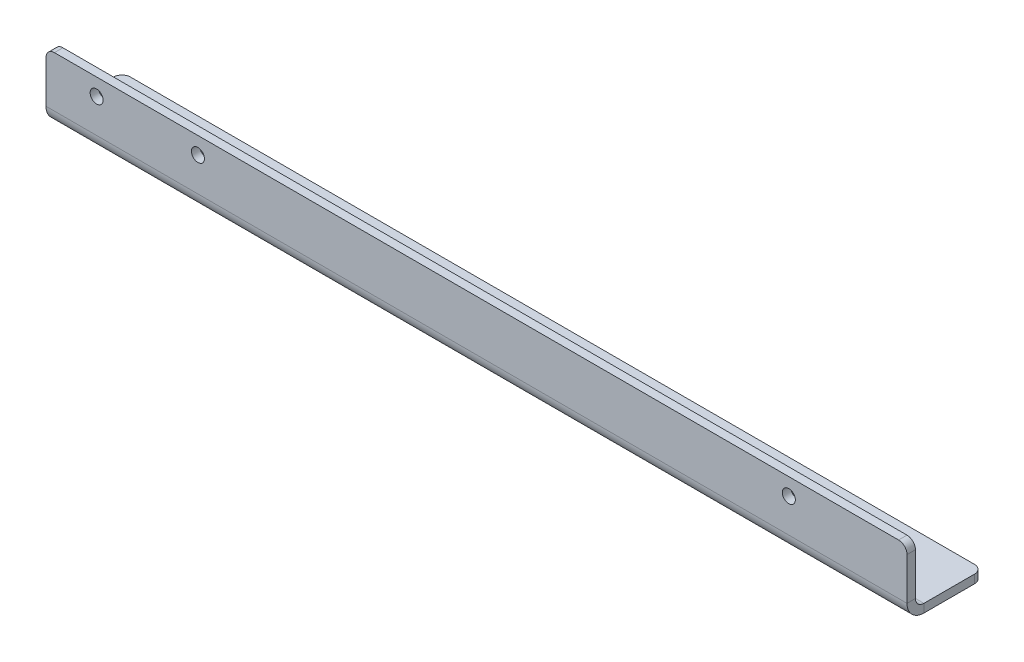
ISO-10303-21;
HEADER;
FILE_DESCRIPTION(('STEP AP214'),'2;1');
FILE_NAME('part.step','',(''),(''),'','','');
FILE_SCHEMA(('AUTOMOTIVE_DESIGN { 1 0 10303 214 1 1 1 1 }'));
ENDSEC;
DATA;
#1=APPLICATION_CONTEXT('core data for automotive mechanical design processes');
#2=APPLICATION_PROTOCOL_DEFINITION('international standard','automotive_design',2000,#1);
#3=PRODUCT_CONTEXT('',#1,'mechanical');
#4=PRODUCT('Part','Part','',(#3));
#5=PRODUCT_RELATED_PRODUCT_CATEGORY('part','',(#4));
#6=PRODUCT_DEFINITION_FORMATION('','',#4);
#7=PRODUCT_DEFINITION_CONTEXT('part definition',#1,'design');
#8=PRODUCT_DEFINITION('design','',#6,#7);
#9=PRODUCT_DEFINITION_SHAPE('','',#8);
#10=(LENGTH_UNIT() NAMED_UNIT(*) SI_UNIT(.MILLI.,.METRE.));
#11=(NAMED_UNIT(*) PLANE_ANGLE_UNIT() SI_UNIT($,.RADIAN.));
#12=(NAMED_UNIT(*) SI_UNIT($,.STERADIAN.) SOLID_ANGLE_UNIT());
#13=UNCERTAINTY_MEASURE_WITH_UNIT(LENGTH_MEASURE(1.E-05),#10,'distance_accuracy_value','');
#14=(GEOMETRIC_REPRESENTATION_CONTEXT(3) GLOBAL_UNCERTAINTY_ASSIGNED_CONTEXT((#13)) GLOBAL_UNIT_ASSIGNED_CONTEXT((#10,
#11,#12)) REPRESENTATION_CONTEXT('',''));
#15=CARTESIAN_POINT('',(0.,0.,0.));
#16=DIRECTION('',(0.,0.,1.));
#17=DIRECTION('',(1.,0.,0.));
#18=AXIS2_PLACEMENT_3D('',#15,#16,#17);
#19=CARTESIAN_POINT('',(323.85,-3.175,0.));
#20=DIRECTION('',(1.,0.,0.));
#21=DIRECTION('',(0.,0.,-1.));
#22=AXIS2_PLACEMENT_3D('',#19,#20,#21);
#23=PLANE('',#22);
#24=DIRECTION('',(0.,0.,-1.));
#25=VECTOR('',#24,1.);
#26=CARTESIAN_POINT('',(323.85,-3.175,0.));
#27=LINE('',#26,#25);
#28=CARTESIAN_POINT('',(323.85,-3.17500000000001,-6.34999999999999));
#29=VERTEX_POINT('',#28);
#30=CARTESIAN_POINT('',(323.85,-3.175,-25.4));
#31=VERTEX_POINT('',#30);
#32=EDGE_CURVE('E421',#29,#31,#27,.T.);
#33=ORIENTED_EDGE('',*,*,#32,.T.);
#34=DIRECTION('',(0.,1.,0.));
#35=VECTOR('',#34,1.);
#36=CARTESIAN_POINT('',(323.85,-3.175,-25.4));
#37=LINE('',#36,#35);
#38=CARTESIAN_POINT('',(323.85,0.,-25.4));
#39=VERTEX_POINT('',#38);
#40=EDGE_CURVE('E430',#31,#39,#37,.T.);
#41=ORIENTED_EDGE('',*,*,#40,.T.);
#42=DIRECTION('',(0.,0.,-1.));
#43=VECTOR('',#42,1.);
#44=CARTESIAN_POINT('',(323.85,0.,0.));
#45=LINE('',#44,#43);
#46=CARTESIAN_POINT('',(323.85,0.,-6.34999999999999));
#47=VERTEX_POINT('',#46);
#48=EDGE_CURVE('E433',#47,#39,#45,.T.);
#49=ORIENTED_EDGE('',*,*,#48,.F.);
#50=DIRECTION('',(0.,-1.,0.));
#51=VECTOR('',#50,1.);
#52=CARTESIAN_POINT('',(323.85,0.,-6.34999999999999));
#53=LINE('',#52,#51);
#54=EDGE_CURVE('E399',#47,#29,#53,.T.);
#55=ORIENTED_EDGE('',*,*,#54,.T.);
#56=EDGE_LOOP('',(#33,#41,#49,#55));
#57=FACE_BOUND('',#56,.T.);
#58=ADVANCED_FACE('F246',(#57),#23,.T.);
#59=CARTESIAN_POINT('',(0.,-3.175,0.));
#60=DIRECTION('',(0.,1.,0.));
#61=DIRECTION('',(0.,0.,1.));
#62=AXIS2_PLACEMENT_3D('',#59,#60,#61);
#63=PLANE('',#62);
#64=CARTESIAN_POINT('',(19.05,-3.175,-19.05));
#65=DIRECTION('',(0.,1.,0.));
#66=DIRECTION('',(0.,0.,1.));
#67=AXIS2_PLACEMENT_3D('',#64,#65,#66);
#68=CIRCLE('',#67,2.4511);
#69=CARTESIAN_POINT('',(19.05,-3.175,-16.5989));
#70=VERTEX_POINT('',#69);
#71=EDGE_CURVE('E394',#70,#70,#68,.T.);
#72=ORIENTED_EDGE('',*,*,#71,.T.);
#73=EDGE_LOOP('',(#72));
#74=FACE_BOUND('',#73,.T.);
#75=CARTESIAN_POINT('',(57.15,-3.175,-19.05));
#76=DIRECTION('',(0.,1.,0.));
#77=DIRECTION('',(0.,0.,1.));
#78=AXIS2_PLACEMENT_3D('',#75,#76,#77);
#79=CIRCLE('',#78,2.4511);
#80=CARTESIAN_POINT('',(57.15,-3.175,-16.5989));
#81=VERTEX_POINT('',#80);
#82=EDGE_CURVE('E637',#81,#81,#79,.T.);
#83=ORIENTED_EDGE('',*,*,#82,.T.);
#84=EDGE_LOOP('',(#83));
#85=FACE_BOUND('',#84,.T.);
#86=CARTESIAN_POINT('',(279.4,-3.175,-19.05));
#87=DIRECTION('',(0.,1.,0.));
#88=DIRECTION('',(0.,0.,1.));
#89=AXIS2_PLACEMENT_3D('',#86,#87,#88);
#90=CIRCLE('',#89,2.45109999999997);
#91=CARTESIAN_POINT('',(279.4,-3.175,-16.5989000000001));
#92=VERTEX_POINT('',#91);
#93=EDGE_CURVE('E645',#92,#92,#90,.T.);
#94=ORIENTED_EDGE('',*,*,#93,.T.);
#95=EDGE_LOOP('',(#94));
#96=FACE_BOUND('',#95,.T.);
#97=DIRECTION('',(-1.,0.,0.));
#98=VECTOR('',#97,1.);
#99=CARTESIAN_POINT('',(323.85,-3.175,-28.575));
#100=LINE('',#99,#98);
#101=CARTESIAN_POINT('',(320.675,-3.175,-28.575));
#102=VERTEX_POINT('',#101);
#103=CARTESIAN_POINT('',(3.17499999999998,-3.175,-28.575));
#104=VERTEX_POINT('',#103);
#105=EDGE_CURVE('E426',#102,#104,#100,.T.);
#106=ORIENTED_EDGE('',*,*,#105,.F.);
#107=CARTESIAN_POINT('',(320.675,-3.175,-25.4));
#108=DIRECTION('',(0.,1.,0.));
#109=DIRECTION('',(0.,0.,1.));
#110=AXIS2_PLACEMENT_3D('',#107,#108,#109);
#111=CIRCLE('',#110,3.175);
#112=EDGE_CURVE('E459',#102,#31,#111,.F.);
#113=ORIENTED_EDGE('',*,*,#112,.T.);
#114=ORIENTED_EDGE('',*,*,#32,.F.);
#115=DIRECTION('',(1.,0.,0.));
#116=VECTOR('',#115,1.);
#117=CARTESIAN_POINT('',(323.85,-3.17500000000001,-6.34999999999999));
#118=LINE('',#117,#116);
#119=CARTESIAN_POINT('',(1.66533453693773E-13,-3.175,-6.34999999999999));
#120=VERTEX_POINT('',#119);
#121=EDGE_CURVE('E347',#29,#120,#118,.F.);
#122=ORIENTED_EDGE('',*,*,#121,.T.);
#123=DIRECTION('',(0.,0.,1.));
#124=VECTOR('',#123,1.);
#125=CARTESIAN_POINT('',(0.,-3.175,-28.575));
#126=LINE('',#125,#124);
#127=CARTESIAN_POINT('',(0.,-3.175,-25.4));
#128=VERTEX_POINT('',#127);
#129=EDGE_CURVE('E418',#128,#120,#126,.T.);
#130=ORIENTED_EDGE('',*,*,#129,.F.);
#131=CARTESIAN_POINT('',(3.17499999999998,-3.175,-25.4));
#132=DIRECTION('',(0.,1.,0.));
#133=DIRECTION('',(0.,0.,1.));
#134=AXIS2_PLACEMENT_3D('',#131,#132,#133);
#135=CIRCLE('',#134,3.175);
#136=EDGE_CURVE('E456',#128,#104,#135,.F.);
#137=ORIENTED_EDGE('',*,*,#136,.T.);
#138=EDGE_LOOP('',(#106,#113,#114,#122,#130,#137));
#139=FACE_BOUND('',#138,.T.);
#140=ADVANCED_FACE('F508',(#74,#85,#96,#139),#63,.F.);
#141=CARTESIAN_POINT('',(0.,0.,0.));
#142=DIRECTION('',(0.,1.,0.));
#143=DIRECTION('',(0.,0.,1.));
#144=AXIS2_PLACEMENT_3D('',#141,#142,#143);
#145=PLANE('',#144);
#146=CARTESIAN_POINT('',(19.05,0.,-19.05));
#147=DIRECTION('',(0.,1.,0.));
#148=DIRECTION('',(0.,0.,1.));
#149=AXIS2_PLACEMENT_3D('',#146,#147,#148);
#150=CIRCLE('',#149,2.4511);
#151=CARTESIAN_POINT('',(19.05,0.,-16.5989));
#152=VERTEX_POINT('',#151);
#153=EDGE_CURVE('E633',#152,#152,#150,.T.);
#154=ORIENTED_EDGE('',*,*,#153,.F.);
#155=EDGE_LOOP('',(#154));
#156=FACE_BOUND('',#155,.T.);
#157=CARTESIAN_POINT('',(57.15,0.,-19.05));
#158=DIRECTION('',(0.,1.,0.));
#159=DIRECTION('',(0.,0.,1.));
#160=AXIS2_PLACEMENT_3D('',#157,#158,#159);
#161=CIRCLE('',#160,2.4511);
#162=CARTESIAN_POINT('',(57.15,0.,-16.5989));
#163=VERTEX_POINT('',#162);
#164=EDGE_CURVE('E641',#163,#163,#161,.T.);
#165=ORIENTED_EDGE('',*,*,#164,.F.);
#166=EDGE_LOOP('',(#165));
#167=FACE_BOUND('',#166,.T.);
#168=CARTESIAN_POINT('',(279.4,0.,-19.05));
#169=DIRECTION('',(0.,1.,0.));
#170=DIRECTION('',(0.,0.,1.));
#171=AXIS2_PLACEMENT_3D('',#168,#169,#170);
#172=CIRCLE('',#171,2.45109999999997);
#173=CARTESIAN_POINT('',(279.4,0.,-16.5989000000001));
#174=VERTEX_POINT('',#173);
#175=EDGE_CURVE('E613',#174,#174,#172,.T.);
#176=ORIENTED_EDGE('',*,*,#175,.F.);
#177=EDGE_LOOP('',(#176));
#178=FACE_BOUND('',#177,.T.);
#179=ORIENTED_EDGE('',*,*,#48,.T.);
#180=CARTESIAN_POINT('',(320.675,0.,-25.4));
#181=DIRECTION('',(0.,1.,0.));
#182=DIRECTION('',(0.,0.,1.));
#183=AXIS2_PLACEMENT_3D('',#180,#181,#182);
#184=CIRCLE('',#183,3.175);
#185=CARTESIAN_POINT('',(320.675,0.,-28.575));
#186=VERTEX_POINT('',#185);
#187=EDGE_CURVE('E446',#39,#186,#184,.T.);
#188=ORIENTED_EDGE('',*,*,#187,.T.);
#189=DIRECTION('',(-1.,0.,0.));
#190=VECTOR('',#189,1.);
#191=CARTESIAN_POINT('',(323.85,0.,-28.575));
#192=LINE('',#191,#190);
#193=CARTESIAN_POINT('',(3.17499999999998,0.,-28.575));
#194=VERTEX_POINT('',#193);
#195=EDGE_CURVE('E422',#186,#194,#192,.T.);
#196=ORIENTED_EDGE('',*,*,#195,.T.);
#197=CARTESIAN_POINT('',(3.17499999999998,0.,-25.4));
#198=DIRECTION('',(0.,1.,0.));
#199=DIRECTION('',(0.,0.,1.));
#200=AXIS2_PLACEMENT_3D('',#197,#198,#199);
#201=CIRCLE('',#200,3.175);
#202=CARTESIAN_POINT('',(0.,0.,-25.4));
#203=VERTEX_POINT('',#202);
#204=EDGE_CURVE('E443',#194,#203,#201,.T.);
#205=ORIENTED_EDGE('',*,*,#204,.T.);
#206=DIRECTION('',(0.,0.,1.));
#207=VECTOR('',#206,1.);
#208=CARTESIAN_POINT('',(0.,0.,-28.575));
#209=LINE('',#208,#207);
#210=CARTESIAN_POINT('',(1.66533453693773E-13,0.,-6.34999999999999));
#211=VERTEX_POINT('',#210);
#212=EDGE_CURVE('E414',#203,#211,#209,.T.);
#213=ORIENTED_EDGE('',*,*,#212,.T.);
#214=DIRECTION('',(1.,0.,0.));
#215=VECTOR('',#214,1.);
#216=CARTESIAN_POINT('',(323.85,0.,-6.34999999999999));
#217=LINE('',#216,#215);
#218=EDGE_CURVE('E404',#47,#211,#217,.F.);
#219=ORIENTED_EDGE('',*,*,#218,.F.);
#220=EDGE_LOOP('',(#179,#188,#196,#205,#213,#219));
#221=FACE_BOUND('',#220,.T.);
#222=ADVANCED_FACE('F514',(#156,#167,#178,#221),#145,.T.);
#223=CARTESIAN_POINT('',(0.,-3.175,-28.575));
#224=DIRECTION('',(-1.,0.,0.));
#225=DIRECTION('',(0.,0.,1.));
#226=AXIS2_PLACEMENT_3D('',#223,#224,#225);
#227=PLANE('',#226);
#228=ORIENTED_EDGE('',*,*,#212,.F.);
#229=DIRECTION('',(0.,1.,0.));
#230=VECTOR('',#229,1.);
#231=CARTESIAN_POINT('',(0.,-3.175,-25.4));
#232=LINE('',#231,#230);
#233=EDGE_CURVE('E13',#203,#128,#232,.F.);
#234=ORIENTED_EDGE('',*,*,#233,.T.);
#235=ORIENTED_EDGE('',*,*,#129,.T.);
#236=DIRECTION('',(0.,-1.,0.));
#237=VECTOR('',#236,1.);
#238=CARTESIAN_POINT('',(1.66533453693773E-13,0.,-6.34999999999999));
#239=LINE('',#238,#237);
#240=EDGE_CURVE('E410',#211,#120,#239,.T.);
#241=ORIENTED_EDGE('',*,*,#240,.F.);
#242=EDGE_LOOP('',(#228,#234,#235,#241));
#243=FACE_BOUND('',#242,.T.);
#244=ADVANCED_FACE('F502',(#243),#227,.T.);
#245=CARTESIAN_POINT('',(323.85,-3.175,-28.575));
#246=DIRECTION('',(0.,0.,-1.));
#247=DIRECTION('',(-1.,0.,0.));
#248=AXIS2_PLACEMENT_3D('',#245,#246,#247);
#249=PLANE('',#248);
#250=ORIENTED_EDGE('',*,*,#195,.F.);
#251=DIRECTION('',(0.,1.,0.));
#252=VECTOR('',#251,1.);
#253=CARTESIAN_POINT('',(320.675,-3.175,-28.575));
#254=LINE('',#253,#252);
#255=EDGE_CURVE('E453',#186,#102,#254,.F.);
#256=ORIENTED_EDGE('',*,*,#255,.T.);
#257=ORIENTED_EDGE('',*,*,#105,.T.);
#258=DIRECTION('',(0.,1.,0.));
#259=VECTOR('',#258,1.);
#260=CARTESIAN_POINT('',(3.17499999999998,-3.175,-28.575));
#261=LINE('',#260,#259);
#262=EDGE_CURVE('E449',#104,#194,#261,.T.);
#263=ORIENTED_EDGE('',*,*,#262,.T.);
#264=EDGE_LOOP('',(#250,#256,#257,#263));
#265=FACE_BOUND('',#264,.T.);
#266=ADVANCED_FACE('F519',(#265),#249,.T.);
#267=CARTESIAN_POINT('',(1.11022302462516E-13,3.17499999999999,-6.34999999999999));
#268=DIRECTION('',(-1.,0.,0.));
#269=DIRECTION('',(0.,0.,1.));
#270=AXIS2_PLACEMENT_3D('',#267,#268,#269);
#271=PLANE('',#270);
#272=DIRECTION('',(0.,0.,-1.));
#273=VECTOR('',#272,1.);
#274=CARTESIAN_POINT('',(0.,3.17499999999999,0.));
#275=LINE('',#274,#273);
#276=CARTESIAN_POINT('',(1.66533453693773E-13,3.17499999999999,-3.17499999999999));
#277=VERTEX_POINT('',#276);
#278=CARTESIAN_POINT('',(2.77555756156289E-13,3.17499999999999,0.));
#279=VERTEX_POINT('',#278);
#280=EDGE_CURVE('E390',#277,#279,#275,.F.);
#281=ORIENTED_EDGE('',*,*,#280,.F.);
#282=CARTESIAN_POINT('',(1.11022302462516E-13,3.17499999999999,-6.34999999999999));
#283=DIRECTION('',(1.,0.,0.));
#284=DIRECTION('',(0.,0.,-1.));
#285=AXIS2_PLACEMENT_3D('',#282,#283,#284);
#286=CIRCLE('',#285,3.175);
#287=EDGE_CURVE('E351',#211,#277,#286,.F.);
#288=ORIENTED_EDGE('',*,*,#287,.F.);
#289=ORIENTED_EDGE('',*,*,#240,.T.);
#290=CARTESIAN_POINT('',(2.77555756156289E-13,3.17499999999999,-6.34999999999999));
#291=DIRECTION('',(1.,0.,0.));
#292=DIRECTION('',(0.,0.,-1.));
#293=AXIS2_PLACEMENT_3D('',#290,#291,#292);
#294=CIRCLE('',#293,6.35);
#295=EDGE_CURVE('E397',#120,#279,#294,.F.);
#296=ORIENTED_EDGE('',*,*,#295,.T.);
#297=EDGE_LOOP('',(#281,#288,#289,#296));
#298=FACE_BOUND('',#297,.T.);
#299=ADVANCED_FACE('F498',(#298),#271,.T.);
#300=CARTESIAN_POINT('',(323.85,3.17499999999999,-6.34999999999999));
#301=DIRECTION('',(-1.,0.,0.));
#302=DIRECTION('',(0.,0.,1.));
#303=AXIS2_PLACEMENT_3D('',#300,#301,#302);
#304=PLANE('',#303);
#305=CARTESIAN_POINT('',(323.85,3.17499999999999,-6.34999999999999));
#306=DIRECTION('',(1.,0.,0.));
#307=DIRECTION('',(0.,0.,-1.));
#308=AXIS2_PLACEMENT_3D('',#305,#306,#307);
#309=CIRCLE('',#308,3.175);
#310=CARTESIAN_POINT('',(323.85,3.17499999999999,-3.17499999999999));
#311=VERTEX_POINT('',#310);
#312=EDGE_CURVE('E358',#311,#47,#309,.T.);
#313=ORIENTED_EDGE('',*,*,#312,.F.);
#314=DIRECTION('',(0.,0.,-1.));
#315=VECTOR('',#314,1.);
#316=CARTESIAN_POINT('',(323.85,3.17499999999999,-3.17499999999999));
#317=LINE('',#316,#315);
#318=CARTESIAN_POINT('',(323.85,3.17499999999999,0.));
#319=VERTEX_POINT('',#318);
#320=EDGE_CURVE('E355',#311,#319,#317,.F.);
#321=ORIENTED_EDGE('',*,*,#320,.T.);
#322=CARTESIAN_POINT('',(323.85,3.17499999999999,-6.34999999999999));
#323=DIRECTION('',(1.,0.,0.));
#324=DIRECTION('',(0.,0.,-1.));
#325=AXIS2_PLACEMENT_3D('',#322,#323,#324);
#326=CIRCLE('',#325,6.35);
#327=EDGE_CURVE('E339',#319,#29,#326,.T.);
#328=ORIENTED_EDGE('',*,*,#327,.T.);
#329=ORIENTED_EDGE('',*,*,#54,.F.);
#330=EDGE_LOOP('',(#313,#321,#328,#329));
#331=FACE_BOUND('',#330,.T.);
#332=ADVANCED_FACE('F356',(#331),#304,.F.);
#333=CARTESIAN_POINT('',(323.85,3.17499999999999,-6.34999999999999));
#334=DIRECTION('',(1.,0.,0.));
#335=DIRECTION('',(0.,0.,1.));
#336=AXIS2_PLACEMENT_3D('',#333,#334,#335);
#337=CYLINDRICAL_SURFACE('',#336,6.35);
#338=ORIENTED_EDGE('',*,*,#121,.F.);
#339=ORIENTED_EDGE('',*,*,#327,.F.);
#340=DIRECTION('',(1.,0.,0.));
#341=VECTOR('',#340,1.);
#342=CARTESIAN_POINT('',(0.,3.17499999999999,0.));
#343=LINE('',#342,#341);
#344=EDGE_CURVE('E344',#319,#279,#343,.F.);
#345=ORIENTED_EDGE('',*,*,#344,.T.);
#346=ORIENTED_EDGE('',*,*,#295,.F.);
#347=EDGE_LOOP('',(#338,#339,#345,#346));
#348=FACE_BOUND('',#347,.T.);
#349=ADVANCED_FACE('F341',(#348),#337,.T.);
#350=CARTESIAN_POINT('',(323.85,3.17499999999999,-6.34999999999999));
#351=DIRECTION('',(1.,0.,0.));
#352=DIRECTION('',(0.,0.,1.));
#353=AXIS2_PLACEMENT_3D('',#350,#351,#352);
#354=CYLINDRICAL_SURFACE('',#353,3.175);
#355=ORIENTED_EDGE('',*,*,#218,.T.);
#356=ORIENTED_EDGE('',*,*,#287,.T.);
#357=DIRECTION('',(1.,0.,0.));
#358=VECTOR('',#357,1.);
#359=CARTESIAN_POINT('',(0.,3.17499999999999,-3.17499999999999));
#360=LINE('',#359,#358);
#361=EDGE_CURVE('E361',#277,#311,#360,.T.);
#362=ORIENTED_EDGE('',*,*,#361,.T.);
#363=ORIENTED_EDGE('',*,*,#312,.T.);
#364=EDGE_LOOP('',(#355,#356,#362,#363));
#365=FACE_BOUND('',#364,.T.);
#366=ADVANCED_FACE('F495',(#365),#354,.F.);
#367=CARTESIAN_POINT('',(323.85,22.225,0.));
#368=DIRECTION('',(-1.,0.,0.));
#369=DIRECTION('',(0.,0.,1.));
#370=AXIS2_PLACEMENT_3D('',#367,#368,#369);
#371=PLANE('',#370);
#372=DIRECTION('',(0.,-1.,0.));
#373=VECTOR('',#372,1.);
#374=CARTESIAN_POINT('',(323.85,22.225,-3.175));
#375=LINE('',#374,#373);
#376=CARTESIAN_POINT('',(323.85,19.05,-3.175));
#377=VERTEX_POINT('',#376);
#378=EDGE_CURVE('E368',#311,#377,#375,.F.);
#379=ORIENTED_EDGE('',*,*,#378,.T.);
#380=DIRECTION('',(0.,0.,-1.));
#381=VECTOR('',#380,1.);
#382=CARTESIAN_POINT('',(323.85,19.05,0.));
#383=LINE('',#382,#381);
#384=CARTESIAN_POINT('',(323.85,19.05,0.));
#385=VERTEX_POINT('',#384);
#386=EDGE_CURVE('E270',#377,#385,#383,.F.);
#387=ORIENTED_EDGE('',*,*,#386,.T.);
#388=DIRECTION('',(0.,1.,0.));
#389=VECTOR('',#388,1.);
#390=CARTESIAN_POINT('',(323.85,0.,0.));
#391=LINE('',#390,#389);
#392=EDGE_CURVE('E364',#319,#385,#391,.T.);
#393=ORIENTED_EDGE('',*,*,#392,.F.);
#394=ORIENTED_EDGE('',*,*,#320,.F.);
#395=EDGE_LOOP('',(#379,#387,#393,#394));
#396=FACE_BOUND('',#395,.T.);
#397=ADVANCED_FACE('F370',(#396),#371,.F.);
#398=CARTESIAN_POINT('',(0.,0.,0.));
#399=DIRECTION('',(1.,0.,0.));
#400=DIRECTION('',(0.,0.,-1.));
#401=AXIS2_PLACEMENT_3D('',#398,#399,#400);
#402=PLANE('',#401);
#403=DIRECTION('',(0.,-1.,0.));
#404=VECTOR('',#403,1.);
#405=CARTESIAN_POINT('',(0.,0.,0.));
#406=LINE('',#405,#404);
#407=CARTESIAN_POINT('',(0.,19.05,0.));
#408=VERTEX_POINT('',#407);
#409=EDGE_CURVE('E366',#408,#279,#406,.T.);
#410=ORIENTED_EDGE('',*,*,#409,.F.);
#411=DIRECTION('',(0.,0.,-1.));
#412=VECTOR('',#411,1.);
#413=CARTESIAN_POINT('',(0.,19.05,0.));
#414=LINE('',#413,#412);
#415=CARTESIAN_POINT('',(0.,19.05,-3.175));
#416=VERTEX_POINT('',#415);
#417=EDGE_CURVE('E255',#408,#416,#414,.T.);
#418=ORIENTED_EDGE('',*,*,#417,.T.);
#419=DIRECTION('',(0.,1.,0.));
#420=VECTOR('',#419,1.);
#421=CARTESIAN_POINT('',(0.,0.,-3.175));
#422=LINE('',#421,#420);
#423=EDGE_CURVE('E373',#416,#277,#422,.F.);
#424=ORIENTED_EDGE('',*,*,#423,.T.);
#425=ORIENTED_EDGE('',*,*,#280,.T.);
#426=EDGE_LOOP('',(#410,#418,#424,#425));
#427=FACE_BOUND('',#426,.T.);
#428=ADVANCED_FACE('F487',(#427),#402,.F.);
#429=CARTESIAN_POINT('',(0.,0.,0.));
#430=DIRECTION('',(0.,0.,-1.));
#431=DIRECTION('',(-1.,0.,0.));
#432=AXIS2_PLACEMENT_3D('',#429,#430,#431);
#433=PLANE('',#432);
#434=CARTESIAN_POINT('',(19.05,15.875,0.));
#435=DIRECTION('',(0.,0.,1.));
#436=DIRECTION('',(1.,0.,0.));
#437=AXIS2_PLACEMENT_3D('',#434,#435,#436);
#438=CIRCLE('',#437,2.4511);
#439=CARTESIAN_POINT('',(21.5011,15.875,0.));
#440=VERTEX_POINT('',#439);
#441=EDGE_CURVE('E606',#440,#440,#438,.T.);
#442=ORIENTED_EDGE('',*,*,#441,.F.);
#443=EDGE_LOOP('',(#442));
#444=FACE_BOUND('',#443,.T.);
#445=CARTESIAN_POINT('',(57.15,15.875,0.));
#446=DIRECTION('',(0.,0.,1.));
#447=DIRECTION('',(1.,0.,0.));
#448=AXIS2_PLACEMENT_3D('',#445,#446,#447);
#449=CIRCLE('',#448,2.4511);
#450=CARTESIAN_POINT('',(59.6011,15.875,0.));
#451=VERTEX_POINT('',#450);
#452=EDGE_CURVE('E616',#451,#451,#449,.T.);
#453=ORIENTED_EDGE('',*,*,#452,.F.);
#454=EDGE_LOOP('',(#453));
#455=FACE_BOUND('',#454,.T.);
#456=CARTESIAN_POINT('',(279.4,15.875,0.));
#457=DIRECTION('',(0.,0.,1.));
#458=DIRECTION('',(1.,0.,0.));
#459=AXIS2_PLACEMENT_3D('',#456,#457,#458);
#460=CIRCLE('',#459,2.45109999999997);
#461=CARTESIAN_POINT('',(281.8511,15.875,0.));
#462=VERTEX_POINT('',#461);
#463=EDGE_CURVE('E626',#462,#462,#460,.T.);
#464=ORIENTED_EDGE('',*,*,#463,.F.);
#465=EDGE_LOOP('',(#464));
#466=FACE_BOUND('',#465,.T.);
#467=ORIENTED_EDGE('',*,*,#392,.T.);
#468=CARTESIAN_POINT('',(320.675,19.05,0.));
#469=DIRECTION('',(0.,0.,-1.));
#470=DIRECTION('',(-1.,0.,0.));
#471=AXIS2_PLACEMENT_3D('',#468,#469,#470);
#472=CIRCLE('',#471,3.175);
#473=CARTESIAN_POINT('',(320.675,22.225,0.));
#474=VERTEX_POINT('',#473);
#475=EDGE_CURVE('E479',#385,#474,#472,.F.);
#476=ORIENTED_EDGE('',*,*,#475,.T.);
#477=DIRECTION('',(-1.,0.,0.));
#478=VECTOR('',#477,1.);
#479=CARTESIAN_POINT('',(0.,22.225,0.));
#480=LINE('',#479,#478);
#481=CARTESIAN_POINT('',(3.175,22.225,0.));
#482=VERTEX_POINT('',#481);
#483=EDGE_CURVE('E372',#474,#482,#480,.T.);
#484=ORIENTED_EDGE('',*,*,#483,.T.);
#485=CARTESIAN_POINT('',(3.175,19.05,0.));
#486=DIRECTION('',(0.,0.,-1.));
#487=DIRECTION('',(-1.,0.,0.));
#488=AXIS2_PLACEMENT_3D('',#485,#486,#487);
#489=CIRCLE('',#488,3.175);
#490=EDGE_CURVE('E262',#482,#408,#489,.F.);
#491=ORIENTED_EDGE('',*,*,#490,.T.);
#492=ORIENTED_EDGE('',*,*,#409,.T.);
#493=ORIENTED_EDGE('',*,*,#344,.F.);
#494=EDGE_LOOP('',(#467,#476,#484,#491,#492,#493));
#495=FACE_BOUND('',#494,.T.);
#496=ADVANCED_FACE('F363',(#444,#455,#466,#495),#433,.F.);
#497=CARTESIAN_POINT('',(0.,0.,-3.175));
#498=DIRECTION('',(0.,0.,-1.));
#499=DIRECTION('',(-1.,0.,0.));
#500=AXIS2_PLACEMENT_3D('',#497,#498,#499);
#501=PLANE('',#500);
#502=CARTESIAN_POINT('',(19.05,15.875,-3.175));
#503=DIRECTION('',(0.,0.,1.));
#504=DIRECTION('',(1.,0.,0.));
#505=AXIS2_PLACEMENT_3D('',#502,#503,#504);
#506=CIRCLE('',#505,2.4511);
#507=CARTESIAN_POINT('',(21.5011,15.875,-3.175));
#508=VERTEX_POINT('',#507);
#509=EDGE_CURVE('E603',#508,#508,#506,.T.);
#510=ORIENTED_EDGE('',*,*,#509,.T.);
#511=EDGE_LOOP('',(#510));
#512=FACE_BOUND('',#511,.T.);
#513=CARTESIAN_POINT('',(57.15,15.875,-3.175));
#514=DIRECTION('',(0.,0.,1.));
#515=DIRECTION('',(1.,0.,0.));
#516=AXIS2_PLACEMENT_3D('',#513,#514,#515);
#517=CIRCLE('',#516,2.4511);
#518=CARTESIAN_POINT('',(59.6011,15.875,-3.175));
#519=VERTEX_POINT('',#518);
#520=EDGE_CURVE('E608',#519,#519,#517,.T.);
#521=ORIENTED_EDGE('',*,*,#520,.T.);
#522=EDGE_LOOP('',(#521));
#523=FACE_BOUND('',#522,.T.);
#524=CARTESIAN_POINT('',(279.4,15.875,-3.175));
#525=DIRECTION('',(0.,0.,1.));
#526=DIRECTION('',(1.,0.,0.));
#527=AXIS2_PLACEMENT_3D('',#524,#525,#526);
#528=CIRCLE('',#527,2.45109999999997);
#529=CARTESIAN_POINT('',(281.8511,15.875,-3.175));
#530=VERTEX_POINT('',#529);
#531=EDGE_CURVE('E622',#530,#530,#528,.T.);
#532=ORIENTED_EDGE('',*,*,#531,.T.);
#533=EDGE_LOOP('',(#532));
#534=FACE_BOUND('',#533,.T.);
#535=DIRECTION('',(1.,0.,0.));
#536=VECTOR('',#535,1.);
#537=CARTESIAN_POINT('',(0.,22.225,-3.175));
#538=LINE('',#537,#536);
#539=CARTESIAN_POINT('',(320.675,22.225,-3.175));
#540=VERTEX_POINT('',#539);
#541=CARTESIAN_POINT('',(3.175,22.225,-3.175));
#542=VERTEX_POINT('',#541);
#543=EDGE_CURVE('E379',#540,#542,#538,.F.);
#544=ORIENTED_EDGE('',*,*,#543,.F.);
#545=CARTESIAN_POINT('',(320.675,19.05,-3.175));
#546=DIRECTION('',(0.,0.,-1.));
#547=DIRECTION('',(-1.,0.,0.));
#548=AXIS2_PLACEMENT_3D('',#545,#546,#547);
#549=CIRCLE('',#548,3.175);
#550=EDGE_CURVE('E472',#540,#377,#549,.T.);
#551=ORIENTED_EDGE('',*,*,#550,.T.);
#552=ORIENTED_EDGE('',*,*,#378,.F.);
#553=ORIENTED_EDGE('',*,*,#361,.F.);
#554=ORIENTED_EDGE('',*,*,#423,.F.);
#555=CARTESIAN_POINT('',(3.175,19.05,-3.175));
#556=DIRECTION('',(0.,0.,-1.));
#557=DIRECTION('',(-1.,0.,0.));
#558=AXIS2_PLACEMENT_3D('',#555,#556,#557);
#559=CIRCLE('',#558,3.175);
#560=EDGE_CURVE('E469',#416,#542,#559,.T.);
#561=ORIENTED_EDGE('',*,*,#560,.T.);
#562=EDGE_LOOP('',(#544,#551,#552,#553,#554,#561));
#563=FACE_BOUND('',#562,.T.);
#564=ADVANCED_FACE('F493',(#512,#523,#534,#563),#501,.T.);
#565=CARTESIAN_POINT('',(0.,22.225,0.));
#566=DIRECTION('',(0.,-1.,0.));
#567=DIRECTION('',(0.,0.,-1.));
#568=AXIS2_PLACEMENT_3D('',#565,#566,#567);
#569=PLANE('',#568);
#570=ORIENTED_EDGE('',*,*,#483,.F.);
#571=DIRECTION('',(0.,0.,-1.));
#572=VECTOR('',#571,1.);
#573=CARTESIAN_POINT('',(320.675,22.225,0.));
#574=LINE('',#573,#572);
#575=EDGE_CURVE('E465',#474,#540,#574,.T.);
#576=ORIENTED_EDGE('',*,*,#575,.T.);
#577=ORIENTED_EDGE('',*,*,#543,.T.);
#578=DIRECTION('',(0.,0.,-1.));
#579=VECTOR('',#578,1.);
#580=CARTESIAN_POINT('',(3.175,22.225,0.));
#581=LINE('',#580,#579);
#582=EDGE_CURVE('E462',#542,#482,#581,.F.);
#583=ORIENTED_EDGE('',*,*,#582,.T.);
#584=EDGE_LOOP('',(#570,#576,#577,#583));
#585=FACE_BOUND('',#584,.T.);
#586=ADVANCED_FACE('F568',(#585),#569,.F.);
#587=CARTESIAN_POINT('',(279.4,-3.175,-19.05));
#588=DIRECTION('',(0.,1.,0.));
#589=DIRECTION('',(0.,0.,1.));
#590=AXIS2_PLACEMENT_3D('',#587,#588,#589);
#591=CYLINDRICAL_SURFACE('',#590,2.45109999999997);
#592=ORIENTED_EDGE('',*,*,#93,.F.);
#593=EDGE_LOOP('',(#592));
#594=FACE_BOUND('',#593,.T.);
#595=ORIENTED_EDGE('',*,*,#175,.T.);
#596=EDGE_LOOP('',(#595));
#597=FACE_BOUND('',#596,.T.);
#598=ADVANCED_FACE('F571',(#594,#597),#591,.F.);
#599=CARTESIAN_POINT('',(57.15,-3.175,-19.05));
#600=DIRECTION('',(0.,1.,0.));
#601=DIRECTION('',(0.,0.,1.));
#602=AXIS2_PLACEMENT_3D('',#599,#600,#601);
#603=CYLINDRICAL_SURFACE('',#602,2.4511);
#604=ORIENTED_EDGE('',*,*,#82,.F.);
#605=EDGE_LOOP('',(#604));
#606=FACE_BOUND('',#605,.T.);
#607=ORIENTED_EDGE('',*,*,#164,.T.);
#608=EDGE_LOOP('',(#607));
#609=FACE_BOUND('',#608,.T.);
#610=ADVANCED_FACE('F534',(#606,#609),#603,.F.);
#611=CARTESIAN_POINT('',(19.05,-3.175,-19.05));
#612=DIRECTION('',(0.,1.,0.));
#613=DIRECTION('',(0.,0.,1.));
#614=AXIS2_PLACEMENT_3D('',#611,#612,#613);
#615=CYLINDRICAL_SURFACE('',#614,2.4511);
#616=ORIENTED_EDGE('',*,*,#71,.F.);
#617=EDGE_LOOP('',(#616));
#618=FACE_BOUND('',#617,.T.);
#619=ORIENTED_EDGE('',*,*,#153,.T.);
#620=EDGE_LOOP('',(#619));
#621=FACE_BOUND('',#620,.T.);
#622=ADVANCED_FACE('F525',(#618,#621),#615,.F.);
#623=CARTESIAN_POINT('',(320.675,-3.175,-25.4));
#624=DIRECTION('',(0.,1.,0.));
#625=DIRECTION('',(0.,0.,1.));
#626=AXIS2_PLACEMENT_3D('',#623,#624,#625);
#627=CYLINDRICAL_SURFACE('',#626,3.175);
#628=ORIENTED_EDGE('',*,*,#112,.F.);
#629=ORIENTED_EDGE('',*,*,#255,.F.);
#630=ORIENTED_EDGE('',*,*,#187,.F.);
#631=ORIENTED_EDGE('',*,*,#40,.F.);
#632=EDGE_LOOP('',(#628,#629,#630,#631));
#633=FACE_BOUND('',#632,.T.);
#634=ADVANCED_FACE('F522',(#633),#627,.T.);
#635=CARTESIAN_POINT('',(320.675,19.05,0.));
#636=DIRECTION('',(0.,0.,-1.));
#637=DIRECTION('',(-1.,0.,0.));
#638=AXIS2_PLACEMENT_3D('',#635,#636,#637);
#639=CYLINDRICAL_SURFACE('',#638,3.175);
#640=ORIENTED_EDGE('',*,*,#475,.F.);
#641=ORIENTED_EDGE('',*,*,#386,.F.);
#642=ORIENTED_EDGE('',*,*,#550,.F.);
#643=ORIENTED_EDGE('',*,*,#575,.F.);
#644=EDGE_LOOP('',(#640,#641,#642,#643));
#645=FACE_BOUND('',#644,.T.);
#646=ADVANCED_FACE('F524',(#645),#639,.T.);
#647=CARTESIAN_POINT('',(3.175,19.05,0.));
#648=DIRECTION('',(0.,0.,-1.));
#649=DIRECTION('',(-1.,0.,0.));
#650=AXIS2_PLACEMENT_3D('',#647,#648,#649);
#651=CYLINDRICAL_SURFACE('',#650,3.175);
#652=ORIENTED_EDGE('',*,*,#490,.F.);
#653=ORIENTED_EDGE('',*,*,#582,.F.);
#654=ORIENTED_EDGE('',*,*,#560,.F.);
#655=ORIENTED_EDGE('',*,*,#417,.F.);
#656=EDGE_LOOP('',(#652,#653,#654,#655));
#657=FACE_BOUND('',#656,.T.);
#658=ADVANCED_FACE('F531',(#657),#651,.T.);
#659=CARTESIAN_POINT('',(3.17499999999998,-3.175,-25.4));
#660=DIRECTION('',(0.,1.,0.));
#661=DIRECTION('',(0.,0.,1.));
#662=AXIS2_PLACEMENT_3D('',#659,#660,#661);
#663=CYLINDRICAL_SURFACE('',#662,3.175);
#664=ORIENTED_EDGE('',*,*,#136,.F.);
#665=ORIENTED_EDGE('',*,*,#233,.F.);
#666=ORIENTED_EDGE('',*,*,#204,.F.);
#667=ORIENTED_EDGE('',*,*,#262,.F.);
#668=EDGE_LOOP('',(#664,#665,#666,#667));
#669=FACE_BOUND('',#668,.T.);
#670=ADVANCED_FACE('F248',(#669),#663,.T.);
#671=CARTESIAN_POINT('',(279.4,15.875,-3.175));
#672=DIRECTION('',(0.,0.,1.));
#673=DIRECTION('',(1.,0.,0.));
#674=AXIS2_PLACEMENT_3D('',#671,#672,#673);
#675=CYLINDRICAL_SURFACE('',#674,2.45109999999997);
#676=ORIENTED_EDGE('',*,*,#531,.F.);
#677=EDGE_LOOP('',(#676));
#678=FACE_BOUND('',#677,.T.);
#679=ORIENTED_EDGE('',*,*,#463,.T.);
#680=EDGE_LOOP('',(#679));
#681=FACE_BOUND('',#680,.T.);
#682=ADVANCED_FACE('F587',(#678,#681),#675,.F.);
#683=CARTESIAN_POINT('',(57.15,15.875,-3.175));
#684=DIRECTION('',(0.,0.,1.));
#685=DIRECTION('',(1.,0.,0.));
#686=AXIS2_PLACEMENT_3D('',#683,#684,#685);
#687=CYLINDRICAL_SURFACE('',#686,2.4511);
#688=ORIENTED_EDGE('',*,*,#520,.F.);
#689=EDGE_LOOP('',(#688));
#690=FACE_BOUND('',#689,.T.);
#691=ORIENTED_EDGE('',*,*,#452,.T.);
#692=EDGE_LOOP('',(#691));
#693=FACE_BOUND('',#692,.T.);
#694=ADVANCED_FACE('F590',(#690,#693),#687,.F.);
#695=CARTESIAN_POINT('',(19.05,15.875,-3.175));
#696=DIRECTION('',(0.,0.,1.));
#697=DIRECTION('',(1.,0.,0.));
#698=AXIS2_PLACEMENT_3D('',#695,#696,#697);
#699=CYLINDRICAL_SURFACE('',#698,2.4511);
#700=ORIENTED_EDGE('',*,*,#509,.F.);
#701=EDGE_LOOP('',(#700));
#702=FACE_BOUND('',#701,.T.);
#703=ORIENTED_EDGE('',*,*,#441,.T.);
#704=EDGE_LOOP('',(#703));
#705=FACE_BOUND('',#704,.T.);
#706=ADVANCED_FACE('F594',(#702,#705),#699,.F.);
#707=CLOSED_SHELL('',(#58,#140,#222,#244,#266,#299,#332,#349,#366,#397,#428,#496,#564,#586,#598,
#610,#622,#634,#646,#658,#670,#682,#694,#706));
#708=MANIFOLD_SOLID_BREP('B2',#707);
#709=ADVANCED_BREP_SHAPE_REPRESENTATION('',(#18,#708),#14);
#710=SHAPE_DEFINITION_REPRESENTATION(#9,#709);
ENDSEC;
END-ISO-10303-21;
